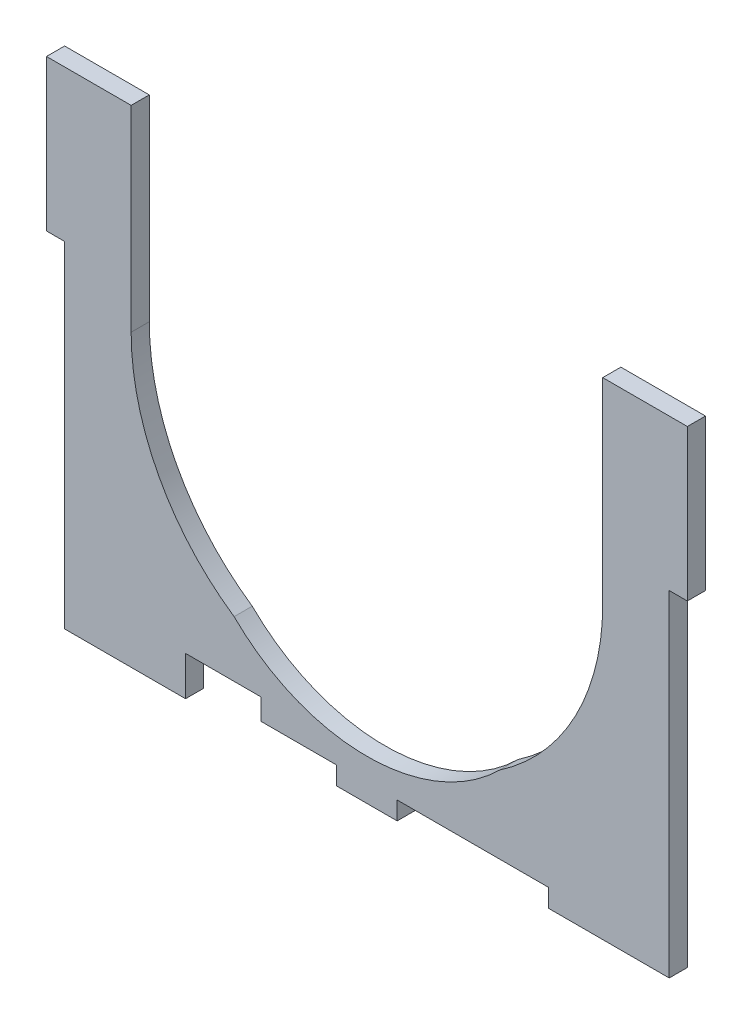
ISO-10303-21;
HEADER;
FILE_DESCRIPTION(('STEP AP214'),'2;1');
FILE_NAME('part.step','',(''),(''),'','','');
FILE_SCHEMA(('AUTOMOTIVE_DESIGN { 1 0 10303 214 1 1 1 1 }'));
ENDSEC;
DATA;
#1=APPLICATION_CONTEXT('core data for automotive mechanical design processes');
#2=APPLICATION_PROTOCOL_DEFINITION('international standard','automotive_design',2000,#1);
#3=PRODUCT_CONTEXT('',#1,'mechanical');
#4=PRODUCT('Part','Part','',(#3));
#5=PRODUCT_RELATED_PRODUCT_CATEGORY('part','',(#4));
#6=PRODUCT_DEFINITION_FORMATION('','',#4);
#7=PRODUCT_DEFINITION_CONTEXT('part definition',#1,'design');
#8=PRODUCT_DEFINITION('design','',#6,#7);
#9=PRODUCT_DEFINITION_SHAPE('','',#8);
#10=(LENGTH_UNIT() NAMED_UNIT(*) SI_UNIT(.MILLI.,.METRE.));
#11=(NAMED_UNIT(*) PLANE_ANGLE_UNIT() SI_UNIT($,.RADIAN.));
#12=(NAMED_UNIT(*) SI_UNIT($,.STERADIAN.) SOLID_ANGLE_UNIT());
#13=UNCERTAINTY_MEASURE_WITH_UNIT(LENGTH_MEASURE(1.E-05),#10,'distance_accuracy_value','');
#14=(GEOMETRIC_REPRESENTATION_CONTEXT(3) GLOBAL_UNCERTAINTY_ASSIGNED_CONTEXT((#13)) GLOBAL_UNIT_ASSIGNED_CONTEXT((#10,
#11,#12)) REPRESENTATION_CONTEXT('',''));
#15=CARTESIAN_POINT('',(0.,0.,0.));
#16=DIRECTION('',(0.,0.,1.));
#17=DIRECTION('',(1.,0.,0.));
#18=AXIS2_PLACEMENT_3D('',#15,#16,#17);
#19=CARTESIAN_POINT('',(0.,0.,6.));
#20=DIRECTION('',(0.,1.,0.));
#21=DIRECTION('',(-1.,0.,0.));
#22=AXIS2_PLACEMENT_3D('',#19,#20,#21);
#23=PLANE('',#22);
#24=DIRECTION('',(1.,0.,0.));
#25=VECTOR('',#24,1.);
#26=CARTESIAN_POINT('',(0.,0.,6.));
#27=LINE('',#26,#25);
#28=CARTESIAN_POINT('',(-135.,0.,6.));
#29=VERTEX_POINT('',#28);
#30=CARTESIAN_POINT('',(-110.,0.,6.));
#31=VERTEX_POINT('',#30);
#32=EDGE_CURVE('E220',#29,#31,#27,.T.);
#33=ORIENTED_EDGE('',*,*,#32,.F.);
#34=DIRECTION('',(0.,0.,1.));
#35=VECTOR('',#34,1.);
#36=CARTESIAN_POINT('',(-135.,0.,-4.));
#37=LINE('',#36,#35);
#38=CARTESIAN_POINT('',(-135.,0.,0.));
#39=VERTEX_POINT('',#38);
#40=EDGE_CURVE('E203',#39,#29,#37,.T.);
#41=ORIENTED_EDGE('',*,*,#40,.F.);
#42=DIRECTION('',(1.,0.,0.));
#43=VECTOR('',#42,1.);
#44=CARTESIAN_POINT('',(0.,0.,0.));
#45=LINE('',#44,#43);
#46=CARTESIAN_POINT('',(-110.,0.,0.));
#47=VERTEX_POINT('',#46);
#48=EDGE_CURVE('E270',#39,#47,#45,.T.);
#49=ORIENTED_EDGE('',*,*,#48,.T.);
#50=DIRECTION('',(0.,0.,1.));
#51=VECTOR('',#50,1.);
#52=CARTESIAN_POINT('',(-110.,0.,0.));
#53=LINE('',#52,#51);
#54=EDGE_CURVE('E226',#47,#31,#53,.T.);
#55=ORIENTED_EDGE('',*,*,#54,.T.);
#56=EDGE_LOOP('',(#33,#41,#49,#55));
#57=FACE_BOUND('',#56,.T.);
#58=ADVANCED_FACE('F43',(#57),#23,.F.);
#59=CARTESIAN_POINT('',(-90.,0.,0.));
#60=VERTEX_POINT('',#59);
#61=CARTESIAN_POINT('',(-40.,0.,0.));
#62=VERTEX_POINT('',#61);
#63=EDGE_CURVE('E64',#60,#62,#45,.T.);
#64=ORIENTED_EDGE('',*,*,#63,.T.);
#65=DIRECTION('',(0.,0.,1.));
#66=VECTOR('',#65,1.);
#67=CARTESIAN_POINT('',(-40.,0.,0.));
#68=LINE('',#67,#66);
#69=CARTESIAN_POINT('',(-40.,0.,6.));
#70=VERTEX_POINT('',#69);
#71=EDGE_CURVE('E59',#62,#70,#68,.T.);
#72=ORIENTED_EDGE('',*,*,#71,.T.);
#73=CARTESIAN_POINT('',(-90.,0.,6.));
#74=VERTEX_POINT('',#73);
#75=EDGE_CURVE('E230',#74,#70,#27,.T.);
#76=ORIENTED_EDGE('',*,*,#75,.F.);
#77=DIRECTION('',(0.,0.,1.));
#78=VECTOR('',#77,1.);
#79=CARTESIAN_POINT('',(-90.,0.,0.));
#80=LINE('',#79,#78);
#81=EDGE_CURVE('E304',#60,#74,#80,.T.);
#82=ORIENTED_EDGE('',*,*,#81,.F.);
#83=EDGE_LOOP('',(#64,#72,#76,#82));
#84=FACE_BOUND('',#83,.T.);
#85=ADVANCED_FACE('F556',(#84),#23,.F.);
#86=CARTESIAN_POINT('',(-200.,0.,6.));
#87=DIRECTION('',(1.,0.,0.));
#88=DIRECTION('',(0.,0.,-1.));
#89=AXIS2_PLACEMENT_3D('',#86,#87,#88);
#90=PLANE('',#89);
#91=DIRECTION('',(0.,0.,1.));
#92=VECTOR('',#91,1.);
#93=CARTESIAN_POINT('',(-200.,105.,0.));
#94=LINE('',#93,#92);
#95=CARTESIAN_POINT('',(-200.,105.,0.));
#96=VERTEX_POINT('',#95);
#97=CARTESIAN_POINT('',(-200.,105.,6.));
#98=VERTEX_POINT('',#97);
#99=EDGE_CURVE('E246',#96,#98,#94,.T.);
#100=ORIENTED_EDGE('',*,*,#99,.F.);
#101=DIRECTION('',(0.,-1.,0.));
#102=VECTOR('',#101,1.);
#103=CARTESIAN_POINT('',(-200.,0.,0.));
#104=LINE('',#103,#102);
#105=CARTESIAN_POINT('',(-200.,-5.99999999999998,0.));
#106=VERTEX_POINT('',#105);
#107=EDGE_CURVE('E267',#96,#106,#104,.T.);
#108=ORIENTED_EDGE('',*,*,#107,.T.);
#109=DIRECTION('',(0.,0.,1.));
#110=VECTOR('',#109,1.);
#111=CARTESIAN_POINT('',(-200.,-5.99999999999998,0.));
#112=LINE('',#111,#110);
#113=CARTESIAN_POINT('',(-200.,-5.99999999999998,6.));
#114=VERTEX_POINT('',#113);
#115=EDGE_CURVE('E347',#106,#114,#112,.T.);
#116=ORIENTED_EDGE('',*,*,#115,.T.);
#117=DIRECTION('',(0.,-1.,0.));
#118=VECTOR('',#117,1.);
#119=CARTESIAN_POINT('',(-200.,0.,6.));
#120=LINE('',#119,#118);
#121=EDGE_CURVE('E237',#98,#114,#120,.T.);
#122=ORIENTED_EDGE('',*,*,#121,.F.);
#123=EDGE_LOOP('',(#100,#108,#116,#122));
#124=FACE_BOUND('',#123,.T.);
#125=ADVANCED_FACE('F440',(#124),#90,.F.);
#126=CARTESIAN_POINT('',(0.,0.,6.));
#127=DIRECTION('',(-1.,0.,0.));
#128=DIRECTION('',(0.,-1.,0.));
#129=AXIS2_PLACEMENT_3D('',#126,#127,#128);
#130=PLANE('',#129);
#131=DIRECTION('',(0.,1.,0.));
#132=VECTOR('',#131,1.);
#133=CARTESIAN_POINT('',(0.,0.,0.));
#134=LINE('',#133,#132);
#135=CARTESIAN_POINT('',(0.,-5.99999999999998,0.));
#136=VERTEX_POINT('',#135);
#137=CARTESIAN_POINT('',(0.,105.,0.));
#138=VERTEX_POINT('',#137);
#139=EDGE_CURVE('E241',#136,#138,#134,.T.);
#140=ORIENTED_EDGE('',*,*,#139,.T.);
#141=DIRECTION('',(0.,0.,1.));
#142=VECTOR('',#141,1.);
#143=CARTESIAN_POINT('',(0.,105.,0.));
#144=LINE('',#143,#142);
#145=CARTESIAN_POINT('',(0.,105.,6.));
#146=VERTEX_POINT('',#145);
#147=EDGE_CURVE('E380',#138,#146,#144,.T.);
#148=ORIENTED_EDGE('',*,*,#147,.T.);
#149=DIRECTION('',(0.,1.,0.));
#150=VECTOR('',#149,1.);
#151=CARTESIAN_POINT('',(0.,0.,6.));
#152=LINE('',#151,#150);
#153=CARTESIAN_POINT('',(0.,-5.99999999999998,6.));
#154=VERTEX_POINT('',#153);
#155=EDGE_CURVE('E272',#154,#146,#152,.T.);
#156=ORIENTED_EDGE('',*,*,#155,.F.);
#157=DIRECTION('',(0.,0.,1.));
#158=VECTOR('',#157,1.);
#159=CARTESIAN_POINT('',(0.,-5.99999999999998,0.));
#160=LINE('',#159,#158);
#161=EDGE_CURVE('E453',#136,#154,#160,.T.);
#162=ORIENTED_EDGE('',*,*,#161,.F.);
#163=EDGE_LOOP('',(#140,#148,#156,#162));
#164=FACE_BOUND('',#163,.T.);
#165=ADVANCED_FACE('F45',(#164),#130,.F.);
#166=CARTESIAN_POINT('',(0.,155.,6.));
#167=DIRECTION('',(0.,-1.,0.));
#168=DIRECTION('',(0.,0.,-1.));
#169=AXIS2_PLACEMENT_3D('',#166,#167,#168);
#170=PLANE('',#169);
#171=DIRECTION('',(-1.,0.,0.));
#172=VECTOR('',#171,1.);
#173=CARTESIAN_POINT('',(0.,155.,0.));
#174=LINE('',#173,#172);
#175=CARTESIAN_POINT('',(6.00000000000003,155.,0.));
#176=VERTEX_POINT('',#175);
#177=CARTESIAN_POINT('',(-21.9999999999999,155.,0.));
#178=VERTEX_POINT('',#177);
#179=EDGE_CURVE('E245',#176,#178,#174,.T.);
#180=ORIENTED_EDGE('',*,*,#179,.T.);
#181=DIRECTION('',(0.,0.,-1.));
#182=VECTOR('',#181,1.);
#183=CARTESIAN_POINT('',(-21.9999999999999,155.,6.));
#184=LINE('',#183,#182);
#185=CARTESIAN_POINT('',(-21.9999999999999,155.,6.));
#186=VERTEX_POINT('',#185);
#187=EDGE_CURVE('E289',#186,#178,#184,.T.);
#188=ORIENTED_EDGE('',*,*,#187,.F.);
#189=DIRECTION('',(-1.,0.,0.));
#190=VECTOR('',#189,1.);
#191=CARTESIAN_POINT('',(0.,155.,6.));
#192=LINE('',#191,#190);
#193=CARTESIAN_POINT('',(6.00000000000003,155.,6.));
#194=VERTEX_POINT('',#193);
#195=EDGE_CURVE('E415',#194,#186,#192,.T.);
#196=ORIENTED_EDGE('',*,*,#195,.F.);
#197=DIRECTION('',(0.,0.,1.));
#198=VECTOR('',#197,1.);
#199=CARTESIAN_POINT('',(6.00000000000003,155.,0.));
#200=LINE('',#199,#198);
#201=EDGE_CURVE('E369',#176,#194,#200,.T.);
#202=ORIENTED_EDGE('',*,*,#201,.F.);
#203=EDGE_LOOP('',(#180,#188,#196,#202));
#204=FACE_BOUND('',#203,.T.);
#205=ADVANCED_FACE('F512',(#204),#170,.F.);
#206=CARTESIAN_POINT('',(-22.,90.,6.));
#207=DIRECTION('',(1.,0.,0.));
#208=DIRECTION('',(0.,1.,0.));
#209=AXIS2_PLACEMENT_3D('',#206,#207,#208);
#210=PLANE('',#209);
#211=DIRECTION('',(0.,-1.,0.));
#212=VECTOR('',#211,1.);
#213=CARTESIAN_POINT('',(-22.,90.,0.));
#214=LINE('',#213,#212);
#215=CARTESIAN_POINT('',(-22.,90.,0.));
#216=VERTEX_POINT('',#215);
#217=EDGE_CURVE('E249',#178,#216,#214,.T.);
#218=ORIENTED_EDGE('',*,*,#217,.T.);
#219=DIRECTION('',(0.,0.,-1.));
#220=VECTOR('',#219,1.);
#221=CARTESIAN_POINT('',(-22.,90.,6.));
#222=LINE('',#221,#220);
#223=CARTESIAN_POINT('',(-22.,90.,6.));
#224=VERTEX_POINT('',#223);
#225=EDGE_CURVE('E285',#224,#216,#222,.T.);
#226=ORIENTED_EDGE('',*,*,#225,.F.);
#227=DIRECTION('',(0.,-1.,0.));
#228=VECTOR('',#227,1.);
#229=CARTESIAN_POINT('',(-22.,90.,6.));
#230=LINE('',#229,#228);
#231=EDGE_CURVE('E418',#186,#224,#230,.T.);
#232=ORIENTED_EDGE('',*,*,#231,.F.);
#233=ORIENTED_EDGE('',*,*,#187,.T.);
#234=EDGE_LOOP('',(#218,#226,#232,#233));
#235=FACE_BOUND('',#234,.T.);
#236=ADVANCED_FACE('F514',(#235),#210,.F.);
#237=CARTESIAN_POINT('',(-100.,90.,6.));
#238=DIRECTION('',(0.,0.,-1.));
#239=DIRECTION('',(-1.,0.,0.));
#240=AXIS2_PLACEMENT_3D('',#237,#238,#239);
#241=CYLINDRICAL_SURFACE('',#240,78.);
#242=CARTESIAN_POINT('',(-100.,90.,0.));
#243=DIRECTION('',(0.,0.,-1.));
#244=DIRECTION('',(1.,0.,0.));
#245=AXIS2_PLACEMENT_3D('',#242,#243,#244);
#246=CIRCLE('',#245,78.);
#247=CARTESIAN_POINT('',(-56.0568198017315,25.5562499999999,0.));
#248=VERTEX_POINT('',#247);
#249=EDGE_CURVE('E252',#216,#248,#246,.T.);
#250=ORIENTED_EDGE('',*,*,#249,.T.);
#251=DIRECTION('',(0.,0.,-1.));
#252=VECTOR('',#251,1.);
#253=CARTESIAN_POINT('',(-56.0568198017315,25.5562499999999,6.));
#254=LINE('',#253,#252);
#255=CARTESIAN_POINT('',(-56.0568198017315,25.5562499999999,6.));
#256=VERTEX_POINT('',#255);
#257=EDGE_CURVE('E281',#256,#248,#254,.T.);
#258=ORIENTED_EDGE('',*,*,#257,.F.);
#259=CARTESIAN_POINT('',(-100.,90.,6.));
#260=DIRECTION('',(0.,0.,-1.));
#261=DIRECTION('',(1.,0.,0.));
#262=AXIS2_PLACEMENT_3D('',#259,#260,#261);
#263=CIRCLE('',#262,78.);
#264=EDGE_CURVE('E421',#224,#256,#263,.T.);
#265=ORIENTED_EDGE('',*,*,#264,.F.);
#266=ORIENTED_EDGE('',*,*,#225,.T.);
#267=EDGE_LOOP('',(#250,#258,#265,#266));
#268=FACE_BOUND('',#267,.T.);
#269=ADVANCED_FACE('F519',(#268),#241,.F.);
#270=CARTESIAN_POINT('',(-100.,70.,6.));
#271=DIRECTION('',(0.,0.,-1.));
#272=DIRECTION('',(-1.,0.,0.));
#273=AXIS2_PLACEMENT_3D('',#270,#271,#272);
#274=CYLINDRICAL_SURFACE('',#273,62.5);
#275=CARTESIAN_POINT('',(-100.,70.,0.));
#276=DIRECTION('',(0.,0.,-1.));
#277=DIRECTION('',(1.,0.,0.));
#278=AXIS2_PLACEMENT_3D('',#275,#276,#277);
#279=CIRCLE('',#278,62.5);
#280=CARTESIAN_POINT('',(-143.943180198269,25.5562500000001,0.));
#281=VERTEX_POINT('',#280);
#282=EDGE_CURVE('E255',#248,#281,#279,.T.);
#283=ORIENTED_EDGE('',*,*,#282,.T.);
#284=DIRECTION('',(0.,0.,-1.));
#285=VECTOR('',#284,1.);
#286=CARTESIAN_POINT('',(-143.943180198269,25.5562500000001,6.));
#287=LINE('',#286,#285);
#288=CARTESIAN_POINT('',(-143.943180198269,25.5562500000001,6.));
#289=VERTEX_POINT('',#288);
#290=EDGE_CURVE('E277',#289,#281,#287,.T.);
#291=ORIENTED_EDGE('',*,*,#290,.F.);
#292=CARTESIAN_POINT('',(-100.,70.,6.));
#293=DIRECTION('',(0.,0.,-1.));
#294=DIRECTION('',(1.,0.,0.));
#295=AXIS2_PLACEMENT_3D('',#292,#293,#294);
#296=CIRCLE('',#295,62.5);
#297=EDGE_CURVE('E424',#256,#289,#296,.T.);
#298=ORIENTED_EDGE('',*,*,#297,.F.);
#299=ORIENTED_EDGE('',*,*,#257,.T.);
#300=EDGE_LOOP('',(#283,#291,#298,#299));
#301=FACE_BOUND('',#300,.T.);
#302=ADVANCED_FACE('F525',(#301),#274,.F.);
#303=CARTESIAN_POINT('',(-100.,90.,6.));
#304=DIRECTION('',(0.,0.,-1.));
#305=DIRECTION('',(-1.,0.,0.));
#306=AXIS2_PLACEMENT_3D('',#303,#304,#305);
#307=CYLINDRICAL_SURFACE('',#306,78.);
#308=CARTESIAN_POINT('',(-100.,90.,0.));
#309=DIRECTION('',(0.,0.,-1.));
#310=DIRECTION('',(1.,0.,0.));
#311=AXIS2_PLACEMENT_3D('',#308,#309,#310);
#312=CIRCLE('',#311,78.);
#313=CARTESIAN_POINT('',(-178.,90.,0.));
#314=VERTEX_POINT('',#313);
#315=EDGE_CURVE('E258',#281,#314,#312,.T.);
#316=ORIENTED_EDGE('',*,*,#315,.T.);
#317=DIRECTION('',(0.,0.,-1.));
#318=VECTOR('',#317,1.);
#319=CARTESIAN_POINT('',(-178.,90.,6.));
#320=LINE('',#319,#318);
#321=CARTESIAN_POINT('',(-178.,90.,6.));
#322=VERTEX_POINT('',#321);
#323=EDGE_CURVE('E235',#322,#314,#320,.T.);
#324=ORIENTED_EDGE('',*,*,#323,.F.);
#325=CARTESIAN_POINT('',(-100.,90.,6.));
#326=DIRECTION('',(0.,0.,-1.));
#327=DIRECTION('',(1.,0.,0.));
#328=AXIS2_PLACEMENT_3D('',#325,#326,#327);
#329=CIRCLE('',#328,78.);
#330=EDGE_CURVE('E427',#289,#322,#329,.T.);
#331=ORIENTED_EDGE('',*,*,#330,.F.);
#332=ORIENTED_EDGE('',*,*,#290,.T.);
#333=EDGE_LOOP('',(#316,#324,#331,#332));
#334=FACE_BOUND('',#333,.T.);
#335=ADVANCED_FACE('F529',(#334),#307,.F.);
#336=CARTESIAN_POINT('',(-178.,90.,6.));
#337=DIRECTION('',(-1.,0.,0.));
#338=DIRECTION('',(0.,-1.,0.));
#339=AXIS2_PLACEMENT_3D('',#336,#337,#338);
#340=PLANE('',#339);
#341=DIRECTION('',(0.,1.,0.));
#342=VECTOR('',#341,1.);
#343=CARTESIAN_POINT('',(-178.,90.,0.));
#344=LINE('',#343,#342);
#345=CARTESIAN_POINT('',(-178.,155.,0.));
#346=VERTEX_POINT('',#345);
#347=EDGE_CURVE('E261',#314,#346,#344,.T.);
#348=ORIENTED_EDGE('',*,*,#347,.T.);
#349=DIRECTION('',(0.,0.,-1.));
#350=VECTOR('',#349,1.);
#351=CARTESIAN_POINT('',(-178.,155.,6.));
#352=LINE('',#351,#350);
#353=CARTESIAN_POINT('',(-178.,155.,6.));
#354=VERTEX_POINT('',#353);
#355=EDGE_CURVE('E229',#354,#346,#352,.T.);
#356=ORIENTED_EDGE('',*,*,#355,.F.);
#357=DIRECTION('',(0.,1.,0.));
#358=VECTOR('',#357,1.);
#359=CARTESIAN_POINT('',(-178.,90.,6.));
#360=LINE('',#359,#358);
#361=EDGE_CURVE('E430',#322,#354,#360,.T.);
#362=ORIENTED_EDGE('',*,*,#361,.F.);
#363=ORIENTED_EDGE('',*,*,#323,.T.);
#364=EDGE_LOOP('',(#348,#356,#362,#363));
#365=FACE_BOUND('',#364,.T.);
#366=ADVANCED_FACE('F534',(#365),#340,.F.);
#367=CARTESIAN_POINT('',(-178.,155.,6.));
#368=DIRECTION('',(0.,-1.,0.));
#369=DIRECTION('',(0.,0.,-1.));
#370=AXIS2_PLACEMENT_3D('',#367,#368,#369);
#371=PLANE('',#370);
#372=DIRECTION('',(-1.,0.,0.));
#373=VECTOR('',#372,1.);
#374=CARTESIAN_POINT('',(-178.,155.,0.));
#375=LINE('',#374,#373);
#376=CARTESIAN_POINT('',(-206.,155.,0.));
#377=VERTEX_POINT('',#376);
#378=EDGE_CURVE('E264',#346,#377,#375,.T.);
#379=ORIENTED_EDGE('',*,*,#378,.T.);
#380=DIRECTION('',(0.,0.,1.));
#381=VECTOR('',#380,1.);
#382=CARTESIAN_POINT('',(-206.,155.,0.));
#383=LINE('',#382,#381);
#384=CARTESIAN_POINT('',(-206.,155.,6.));
#385=VERTEX_POINT('',#384);
#386=EDGE_CURVE('E396',#377,#385,#383,.T.);
#387=ORIENTED_EDGE('',*,*,#386,.T.);
#388=DIRECTION('',(-1.,0.,0.));
#389=VECTOR('',#388,1.);
#390=CARTESIAN_POINT('',(-178.,155.,6.));
#391=LINE('',#390,#389);
#392=EDGE_CURVE('E432',#354,#385,#391,.T.);
#393=ORIENTED_EDGE('',*,*,#392,.F.);
#394=ORIENTED_EDGE('',*,*,#355,.T.);
#395=EDGE_LOOP('',(#379,#387,#393,#394));
#396=FACE_BOUND('',#395,.T.);
#397=ADVANCED_FACE('F537',(#396),#371,.F.);
#398=CARTESIAN_POINT('',(-100.,90.,6.));
#399=DIRECTION('',(0.,0.,1.));
#400=DIRECTION('',(1.,0.,0.));
#401=AXIS2_PLACEMENT_3D('',#398,#399,#400);
#402=PLANE('',#401);
#403=DIRECTION('',(0.,1.,0.));
#404=VECTOR('',#403,1.);
#405=CARTESIAN_POINT('',(-160.,0.,6.));
#406=LINE('',#405,#404);
#407=CARTESIAN_POINT('',(-160.,-5.99999999999998,6.));
#408=VERTEX_POINT('',#407);
#409=CARTESIAN_POINT('',(-160.,7.,6.));
#410=VERTEX_POINT('',#409);
#411=EDGE_CURVE('E344',#408,#410,#406,.T.);
#412=ORIENTED_EDGE('',*,*,#411,.T.);
#413=DIRECTION('',(-1.,0.,0.));
#414=VECTOR('',#413,1.);
#415=CARTESIAN_POINT('',(-160.,7.,6.));
#416=LINE('',#415,#414);
#417=CARTESIAN_POINT('',(-135.,7.,6.));
#418=VERTEX_POINT('',#417);
#419=EDGE_CURVE('E215',#418,#410,#416,.T.);
#420=ORIENTED_EDGE('',*,*,#419,.F.);
#421=DIRECTION('',(0.,1.,0.));
#422=VECTOR('',#421,1.);
#423=CARTESIAN_POINT('',(-135.,0.,6.));
#424=LINE('',#423,#422);
#425=EDGE_CURVE('E207',#29,#418,#424,.T.);
#426=ORIENTED_EDGE('',*,*,#425,.F.);
#427=ORIENTED_EDGE('',*,*,#32,.T.);
#428=DIRECTION('',(0.,-1.,0.));
#429=VECTOR('',#428,1.);
#430=CARTESIAN_POINT('',(-110.,0.,6.));
#431=LINE('',#430,#429);
#432=CARTESIAN_POINT('',(-110.,-5.99999999999998,6.));
#433=VERTEX_POINT('',#432);
#434=EDGE_CURVE('E302',#31,#433,#431,.T.);
#435=ORIENTED_EDGE('',*,*,#434,.T.);
#436=DIRECTION('',(1.,0.,0.));
#437=VECTOR('',#436,1.);
#438=CARTESIAN_POINT('',(-110.,-5.99999999999998,6.));
#439=LINE('',#438,#437);
#440=CARTESIAN_POINT('',(-90.,-5.99999999999997,6.));
#441=VERTEX_POINT('',#440);
#442=EDGE_CURVE('E321',#433,#441,#439,.T.);
#443=ORIENTED_EDGE('',*,*,#442,.T.);
#444=DIRECTION('',(0.,1.,0.));
#445=VECTOR('',#444,1.);
#446=CARTESIAN_POINT('',(-90.,0.,6.));
#447=LINE('',#446,#445);
#448=EDGE_CURVE('E317',#441,#74,#447,.T.);
#449=ORIENTED_EDGE('',*,*,#448,.T.);
#450=ORIENTED_EDGE('',*,*,#75,.T.);
#451=DIRECTION('',(0.,-1.,0.));
#452=VECTOR('',#451,1.);
#453=CARTESIAN_POINT('',(-40.,0.,6.));
#454=LINE('',#453,#452);
#455=CARTESIAN_POINT('',(-40.,-5.99999999999998,6.));
#456=VERTEX_POINT('',#455);
#457=EDGE_CURVE('E305',#70,#456,#454,.T.);
#458=ORIENTED_EDGE('',*,*,#457,.T.);
#459=DIRECTION('',(1.,0.,0.));
#460=VECTOR('',#459,1.);
#461=CARTESIAN_POINT('',(0.,-5.99999999999998,6.));
#462=LINE('',#461,#460);
#463=EDGE_CURVE('E313',#456,#154,#462,.T.);
#464=ORIENTED_EDGE('',*,*,#463,.T.);
#465=ORIENTED_EDGE('',*,*,#155,.T.);
#466=DIRECTION('',(1.,0.,0.));
#467=VECTOR('',#466,1.);
#468=CARTESIAN_POINT('',(6.00000000000003,105.,6.));
#469=LINE('',#468,#467);
#470=CARTESIAN_POINT('',(6.00000000000003,105.,6.));
#471=VERTEX_POINT('',#470);
#472=EDGE_CURVE('E365',#146,#471,#469,.T.);
#473=ORIENTED_EDGE('',*,*,#472,.T.);
#474=DIRECTION('',(0.,1.,0.));
#475=VECTOR('',#474,1.);
#476=CARTESIAN_POINT('',(6.00000000000003,155.,6.));
#477=LINE('',#476,#475);
#478=EDGE_CURVE('E356',#471,#194,#477,.T.);
#479=ORIENTED_EDGE('',*,*,#478,.T.);
#480=ORIENTED_EDGE('',*,*,#195,.T.);
#481=ORIENTED_EDGE('',*,*,#231,.T.);
#482=ORIENTED_EDGE('',*,*,#264,.T.);
#483=ORIENTED_EDGE('',*,*,#297,.T.);
#484=ORIENTED_EDGE('',*,*,#330,.T.);
#485=ORIENTED_EDGE('',*,*,#361,.T.);
#486=ORIENTED_EDGE('',*,*,#392,.T.);
#487=DIRECTION('',(0.,-1.,0.));
#488=VECTOR('',#487,1.);
#489=CARTESIAN_POINT('',(-206.,155.,6.));
#490=LINE('',#489,#488);
#491=CARTESIAN_POINT('',(-206.,105.,6.));
#492=VERTEX_POINT('',#491);
#493=EDGE_CURVE('E379',#385,#492,#490,.T.);
#494=ORIENTED_EDGE('',*,*,#493,.T.);
#495=DIRECTION('',(1.,0.,0.));
#496=VECTOR('',#495,1.);
#497=CARTESIAN_POINT('',(-200.,105.,6.));
#498=LINE('',#497,#496);
#499=EDGE_CURVE('E392',#492,#98,#498,.T.);
#500=ORIENTED_EDGE('',*,*,#499,.T.);
#501=ORIENTED_EDGE('',*,*,#121,.T.);
#502=DIRECTION('',(1.,0.,0.));
#503=VECTOR('',#502,1.);
#504=CARTESIAN_POINT('',(-200.,-5.99999999999998,6.));
#505=LINE('',#504,#503);
#506=EDGE_CURVE('E327',#114,#408,#505,.T.);
#507=ORIENTED_EDGE('',*,*,#506,.T.);
#508=EDGE_LOOP('',(#412,#420,#426,#427,#435,#443,#449,#450,#458,#464,#465,#473,#479,#480,#481,
#482,#483,#484,#485,#486,#494,#500,#501,#507));
#509=FACE_BOUND('',#508,.T.);
#510=ADVANCED_FACE('F218',(#509),#402,.T.);
#511=CARTESIAN_POINT('',(-100.,90.,0.));
#512=DIRECTION('',(0.,0.,1.));
#513=DIRECTION('',(1.,0.,0.));
#514=AXIS2_PLACEMENT_3D('',#511,#512,#513);
#515=PLANE('',#514);
#516=DIRECTION('',(-1.,0.,0.));
#517=VECTOR('',#516,1.);
#518=CARTESIAN_POINT('',(-100.,7.00000000000001,0.));
#519=LINE('',#518,#517);
#520=CARTESIAN_POINT('',(-135.,7.,0.));
#521=VERTEX_POINT('',#520);
#522=CARTESIAN_POINT('',(-160.,7.,0.));
#523=VERTEX_POINT('',#522);
#524=EDGE_CURVE('E11',#521,#523,#519,.T.);
#525=ORIENTED_EDGE('',*,*,#524,.T.);
#526=DIRECTION('',(0.,1.,0.));
#527=VECTOR('',#526,1.);
#528=CARTESIAN_POINT('',(-160.,0.,0.));
#529=LINE('',#528,#527);
#530=CARTESIAN_POINT('',(-160.,-5.99999999999998,0.));
#531=VERTEX_POINT('',#530);
#532=EDGE_CURVE('E343',#531,#523,#529,.T.);
#533=ORIENTED_EDGE('',*,*,#532,.F.);
#534=DIRECTION('',(1.,0.,0.));
#535=VECTOR('',#534,1.);
#536=CARTESIAN_POINT('',(-200.,-5.99999999999998,0.));
#537=LINE('',#536,#535);
#538=EDGE_CURVE('E339',#106,#531,#537,.T.);
#539=ORIENTED_EDGE('',*,*,#538,.F.);
#540=ORIENTED_EDGE('',*,*,#107,.F.);
#541=DIRECTION('',(1.,0.,0.));
#542=VECTOR('',#541,1.);
#543=CARTESIAN_POINT('',(-200.,105.,0.));
#544=LINE('',#543,#542);
#545=CARTESIAN_POINT('',(-206.,105.,0.));
#546=VERTEX_POINT('',#545);
#547=EDGE_CURVE('E391',#546,#96,#544,.T.);
#548=ORIENTED_EDGE('',*,*,#547,.F.);
#549=DIRECTION('',(0.,-1.,0.));
#550=VECTOR('',#549,1.);
#551=CARTESIAN_POINT('',(-206.,155.,0.));
#552=LINE('',#551,#550);
#553=EDGE_CURVE('E387',#377,#546,#552,.T.);
#554=ORIENTED_EDGE('',*,*,#553,.F.);
#555=ORIENTED_EDGE('',*,*,#378,.F.);
#556=ORIENTED_EDGE('',*,*,#347,.F.);
#557=ORIENTED_EDGE('',*,*,#315,.F.);
#558=ORIENTED_EDGE('',*,*,#282,.F.);
#559=ORIENTED_EDGE('',*,*,#249,.F.);
#560=ORIENTED_EDGE('',*,*,#217,.F.);
#561=ORIENTED_EDGE('',*,*,#179,.F.);
#562=DIRECTION('',(0.,1.,0.));
#563=VECTOR('',#562,1.);
#564=CARTESIAN_POINT('',(6.00000000000003,155.,0.));
#565=LINE('',#564,#563);
#566=CARTESIAN_POINT('',(6.00000000000003,105.,0.));
#567=VERTEX_POINT('',#566);
#568=EDGE_CURVE('E360',#567,#176,#565,.T.);
#569=ORIENTED_EDGE('',*,*,#568,.F.);
#570=DIRECTION('',(1.,0.,0.));
#571=VECTOR('',#570,1.);
#572=CARTESIAN_POINT('',(6.00000000000003,105.,0.));
#573=LINE('',#572,#571);
#574=EDGE_CURVE('E364',#138,#567,#573,.T.);
#575=ORIENTED_EDGE('',*,*,#574,.F.);
#576=ORIENTED_EDGE('',*,*,#139,.F.);
#577=DIRECTION('',(1.,0.,0.));
#578=VECTOR('',#577,1.);
#579=CARTESIAN_POINT('',(0.,-5.99999999999998,0.));
#580=LINE('',#579,#578);
#581=CARTESIAN_POINT('',(-40.,-5.99999999999998,0.));
#582=VERTEX_POINT('',#581);
#583=EDGE_CURVE('E463',#582,#136,#580,.T.);
#584=ORIENTED_EDGE('',*,*,#583,.F.);
#585=DIRECTION('',(0.,-1.,0.));
#586=VECTOR('',#585,1.);
#587=CARTESIAN_POINT('',(-40.,0.,0.));
#588=LINE('',#587,#586);
#589=EDGE_CURVE('E472',#62,#582,#588,.T.);
#590=ORIENTED_EDGE('',*,*,#589,.F.);
#591=ORIENTED_EDGE('',*,*,#63,.F.);
#592=DIRECTION('',(0.,1.,0.));
#593=VECTOR('',#592,1.);
#594=CARTESIAN_POINT('',(-90.,0.,0.));
#595=LINE('',#594,#593);
#596=CARTESIAN_POINT('',(-90.,-5.99999999999997,0.));
#597=VERTEX_POINT('',#596);
#598=EDGE_CURVE('E328',#597,#60,#595,.T.);
#599=ORIENTED_EDGE('',*,*,#598,.F.);
#600=DIRECTION('',(1.,0.,0.));
#601=VECTOR('',#600,1.);
#602=CARTESIAN_POINT('',(-110.,-5.99999999999998,0.));
#603=LINE('',#602,#601);
#604=CARTESIAN_POINT('',(-110.,-5.99999999999998,0.));
#605=VERTEX_POINT('',#604);
#606=EDGE_CURVE('E332',#605,#597,#603,.T.);
#607=ORIENTED_EDGE('',*,*,#606,.F.);
#608=DIRECTION('',(0.,-1.,0.));
#609=VECTOR('',#608,1.);
#610=CARTESIAN_POINT('',(-110.,0.,0.));
#611=LINE('',#610,#609);
#612=EDGE_CURVE('E299',#47,#605,#611,.T.);
#613=ORIENTED_EDGE('',*,*,#612,.F.);
#614=ORIENTED_EDGE('',*,*,#48,.F.);
#615=DIRECTION('',(0.,1.,0.));
#616=VECTOR('',#615,1.);
#617=CARTESIAN_POINT('',(-135.,90.,0.));
#618=LINE('',#617,#616);
#619=EDGE_CURVE('E52',#39,#521,#618,.T.);
#620=ORIENTED_EDGE('',*,*,#619,.T.);
#621=EDGE_LOOP('',(#525,#533,#539,#540,#548,#554,#555,#556,#557,#558,#559,#560,#561,#569,#575,
#576,#584,#590,#591,#599,#607,#613,#614,#620));
#622=FACE_BOUND('',#621,.T.);
#623=ADVANCED_FACE('F294',(#622),#515,.F.);
#624=CARTESIAN_POINT('',(-200.,105.,0.));
#625=DIRECTION('',(0.,-1.,0.));
#626=DIRECTION('',(0.,0.,-1.));
#627=AXIS2_PLACEMENT_3D('',#624,#625,#626);
#628=PLANE('',#627);
#629=ORIENTED_EDGE('',*,*,#499,.F.);
#630=DIRECTION('',(0.,0.,1.));
#631=VECTOR('',#630,1.);
#632=CARTESIAN_POINT('',(-206.,105.,0.));
#633=LINE('',#632,#631);
#634=EDGE_CURVE('E406',#546,#492,#633,.T.);
#635=ORIENTED_EDGE('',*,*,#634,.F.);
#636=ORIENTED_EDGE('',*,*,#547,.T.);
#637=ORIENTED_EDGE('',*,*,#99,.T.);
#638=EDGE_LOOP('',(#629,#635,#636,#637));
#639=FACE_BOUND('',#638,.T.);
#640=ADVANCED_FACE('F544',(#639),#628,.T.);
#641=CARTESIAN_POINT('',(-206.,155.,0.));
#642=DIRECTION('',(-1.,0.,0.));
#643=DIRECTION('',(0.,0.,1.));
#644=AXIS2_PLACEMENT_3D('',#641,#642,#643);
#645=PLANE('',#644);
#646=ORIENTED_EDGE('',*,*,#493,.F.);
#647=ORIENTED_EDGE('',*,*,#386,.F.);
#648=ORIENTED_EDGE('',*,*,#553,.T.);
#649=ORIENTED_EDGE('',*,*,#634,.T.);
#650=EDGE_LOOP('',(#646,#647,#648,#649));
#651=FACE_BOUND('',#650,.T.);
#652=ADVANCED_FACE('F542',(#651),#645,.T.);
#653=CARTESIAN_POINT('',(6.00000000000003,155.,0.));
#654=DIRECTION('',(1.,0.,0.));
#655=DIRECTION('',(0.,0.,-1.));
#656=AXIS2_PLACEMENT_3D('',#653,#654,#655);
#657=PLANE('',#656);
#658=ORIENTED_EDGE('',*,*,#478,.F.);
#659=DIRECTION('',(0.,0.,1.));
#660=VECTOR('',#659,1.);
#661=CARTESIAN_POINT('',(6.00000000000003,105.,0.));
#662=LINE('',#661,#660);
#663=EDGE_CURVE('E376',#567,#471,#662,.T.);
#664=ORIENTED_EDGE('',*,*,#663,.F.);
#665=ORIENTED_EDGE('',*,*,#568,.T.);
#666=ORIENTED_EDGE('',*,*,#201,.T.);
#667=EDGE_LOOP('',(#658,#664,#665,#666));
#668=FACE_BOUND('',#667,.T.);
#669=ADVANCED_FACE('F507',(#668),#657,.T.);
#670=CARTESIAN_POINT('',(6.00000000000003,105.,0.));
#671=DIRECTION('',(0.,-1.,0.));
#672=DIRECTION('',(0.,0.,-1.));
#673=AXIS2_PLACEMENT_3D('',#670,#671,#672);
#674=PLANE('',#673);
#675=ORIENTED_EDGE('',*,*,#472,.F.);
#676=ORIENTED_EDGE('',*,*,#147,.F.);
#677=ORIENTED_EDGE('',*,*,#574,.T.);
#678=ORIENTED_EDGE('',*,*,#663,.T.);
#679=EDGE_LOOP('',(#675,#676,#677,#678));
#680=FACE_BOUND('',#679,.T.);
#681=ADVANCED_FACE('F501',(#680),#674,.T.);
#682=CARTESIAN_POINT('',(-160.,0.,0.));
#683=DIRECTION('',(1.,0.,0.));
#684=DIRECTION('',(0.,0.,-1.));
#685=AXIS2_PLACEMENT_3D('',#682,#683,#684);
#686=PLANE('',#685);
#687=ORIENTED_EDGE('',*,*,#411,.F.);
#688=DIRECTION('',(0.,0.,1.));
#689=VECTOR('',#688,1.);
#690=CARTESIAN_POINT('',(-160.,-5.99999999999998,0.));
#691=LINE('',#690,#689);
#692=EDGE_CURVE('E353',#531,#408,#691,.T.);
#693=ORIENTED_EDGE('',*,*,#692,.F.);
#694=ORIENTED_EDGE('',*,*,#532,.T.);
#695=DIRECTION('',(0.,0.,1.));
#696=VECTOR('',#695,1.);
#697=CARTESIAN_POINT('',(-160.,7.,-4.));
#698=LINE('',#697,#696);
#699=EDGE_CURVE('E450',#523,#410,#698,.T.);
#700=ORIENTED_EDGE('',*,*,#699,.T.);
#701=EDGE_LOOP('',(#687,#693,#694,#700));
#702=FACE_BOUND('',#701,.T.);
#703=ADVANCED_FACE('F448',(#702),#686,.T.);
#704=CARTESIAN_POINT('',(-200.,-5.99999999999998,0.));
#705=DIRECTION('',(0.,-1.,0.));
#706=DIRECTION('',(0.,0.,-1.));
#707=AXIS2_PLACEMENT_3D('',#704,#705,#706);
#708=PLANE('',#707);
#709=ORIENTED_EDGE('',*,*,#506,.F.);
#710=ORIENTED_EDGE('',*,*,#115,.F.);
#711=ORIENTED_EDGE('',*,*,#538,.T.);
#712=ORIENTED_EDGE('',*,*,#692,.T.);
#713=EDGE_LOOP('',(#709,#710,#711,#712));
#714=FACE_BOUND('',#713,.T.);
#715=ADVANCED_FACE('F444',(#714),#708,.T.);
#716=CARTESIAN_POINT('',(-110.,0.,0.));
#717=DIRECTION('',(-1.,0.,0.));
#718=DIRECTION('',(0.,0.,1.));
#719=AXIS2_PLACEMENT_3D('',#716,#717,#718);
#720=PLANE('',#719);
#721=ORIENTED_EDGE('',*,*,#434,.F.);
#722=ORIENTED_EDGE('',*,*,#54,.F.);
#723=ORIENTED_EDGE('',*,*,#612,.T.);
#724=DIRECTION('',(0.,0.,1.));
#725=VECTOR('',#724,1.);
#726=CARTESIAN_POINT('',(-110.,-5.99999999999998,0.));
#727=LINE('',#726,#725);
#728=EDGE_CURVE('E333',#605,#433,#727,.T.);
#729=ORIENTED_EDGE('',*,*,#728,.T.);
#730=EDGE_LOOP('',(#721,#722,#723,#729));
#731=FACE_BOUND('',#730,.T.);
#732=ADVANCED_FACE('F301',(#731),#720,.T.);
#733=CARTESIAN_POINT('',(-90.,0.,0.));
#734=DIRECTION('',(1.,0.,0.));
#735=DIRECTION('',(0.,0.,-1.));
#736=AXIS2_PLACEMENT_3D('',#733,#734,#735);
#737=PLANE('',#736);
#738=ORIENTED_EDGE('',*,*,#448,.F.);
#739=DIRECTION('',(0.,0.,1.));
#740=VECTOR('',#739,1.);
#741=CARTESIAN_POINT('',(-90.,-5.99999999999997,0.));
#742=LINE('',#741,#740);
#743=EDGE_CURVE('E310',#597,#441,#742,.T.);
#744=ORIENTED_EDGE('',*,*,#743,.F.);
#745=ORIENTED_EDGE('',*,*,#598,.T.);
#746=ORIENTED_EDGE('',*,*,#81,.T.);
#747=EDGE_LOOP('',(#738,#744,#745,#746));
#748=FACE_BOUND('',#747,.T.);
#749=ADVANCED_FACE('F488',(#748),#737,.T.);
#750=CARTESIAN_POINT('',(-110.,-5.99999999999998,0.));
#751=DIRECTION('',(0.,-1.,0.));
#752=DIRECTION('',(1.,0.,0.));
#753=AXIS2_PLACEMENT_3D('',#750,#751,#752);
#754=PLANE('',#753);
#755=ORIENTED_EDGE('',*,*,#442,.F.);
#756=ORIENTED_EDGE('',*,*,#728,.F.);
#757=ORIENTED_EDGE('',*,*,#606,.T.);
#758=ORIENTED_EDGE('',*,*,#743,.T.);
#759=EDGE_LOOP('',(#755,#756,#757,#758));
#760=FACE_BOUND('',#759,.T.);
#761=ADVANCED_FACE('F485',(#760),#754,.T.);
#762=CARTESIAN_POINT('',(0.,-5.99999999999998,0.));
#763=DIRECTION('',(0.,-1.,0.));
#764=DIRECTION('',(1.,0.,0.));
#765=AXIS2_PLACEMENT_3D('',#762,#763,#764);
#766=PLANE('',#765);
#767=ORIENTED_EDGE('',*,*,#463,.F.);
#768=DIRECTION('',(0.,0.,1.));
#769=VECTOR('',#768,1.);
#770=CARTESIAN_POINT('',(-40.,-5.99999999999998,0.));
#771=LINE('',#770,#769);
#772=EDGE_CURVE('E464',#582,#456,#771,.T.);
#773=ORIENTED_EDGE('',*,*,#772,.F.);
#774=ORIENTED_EDGE('',*,*,#583,.T.);
#775=ORIENTED_EDGE('',*,*,#161,.T.);
#776=EDGE_LOOP('',(#767,#773,#774,#775));
#777=FACE_BOUND('',#776,.T.);
#778=ADVANCED_FACE('F496',(#777),#766,.T.);
#779=CARTESIAN_POINT('',(-40.,0.,0.));
#780=DIRECTION('',(-1.,0.,0.));
#781=DIRECTION('',(0.,0.,1.));
#782=AXIS2_PLACEMENT_3D('',#779,#780,#781);
#783=PLANE('',#782);
#784=ORIENTED_EDGE('',*,*,#457,.F.);
#785=ORIENTED_EDGE('',*,*,#71,.F.);
#786=ORIENTED_EDGE('',*,*,#589,.T.);
#787=ORIENTED_EDGE('',*,*,#772,.T.);
#788=EDGE_LOOP('',(#784,#785,#786,#787));
#789=FACE_BOUND('',#788,.T.);
#790=ADVANCED_FACE('F492',(#789),#783,.T.);
#791=CARTESIAN_POINT('',(-160.,7.,-4.));
#792=DIRECTION('',(0.,1.,0.));
#793=DIRECTION('',(0.,0.,1.));
#794=AXIS2_PLACEMENT_3D('',#791,#792,#793);
#795=PLANE('',#794);
#796=DIRECTION('',(0.,0.,1.));
#797=VECTOR('',#796,1.);
#798=CARTESIAN_POINT('',(-135.,7.,-4.));
#799=LINE('',#798,#797);
#800=EDGE_CURVE('E214',#521,#418,#799,.T.);
#801=ORIENTED_EDGE('',*,*,#800,.T.);
#802=ORIENTED_EDGE('',*,*,#419,.T.);
#803=ORIENTED_EDGE('',*,*,#699,.F.);
#804=ORIENTED_EDGE('',*,*,#524,.F.);
#805=EDGE_LOOP('',(#801,#802,#803,#804));
#806=FACE_BOUND('',#805,.T.);
#807=ADVANCED_FACE('F455',(#806),#795,.F.);
#808=CARTESIAN_POINT('',(-135.,0.,-4.));
#809=DIRECTION('',(1.,0.,0.));
#810=DIRECTION('',(0.,0.,-1.));
#811=AXIS2_PLACEMENT_3D('',#808,#809,#810);
#812=PLANE('',#811);
#813=ORIENTED_EDGE('',*,*,#40,.T.);
#814=ORIENTED_EDGE('',*,*,#425,.T.);
#815=ORIENTED_EDGE('',*,*,#800,.F.);
#816=ORIENTED_EDGE('',*,*,#619,.F.);
#817=EDGE_LOOP('',(#813,#814,#815,#816));
#818=FACE_BOUND('',#817,.T.);
#819=ADVANCED_FACE('F205',(#818),#812,.F.);
#820=CLOSED_SHELL('',(#58,#85,#125,#165,#205,#236,#269,#302,#335,#366,#397,#510,#623,#640,#652,
#669,#681,#703,#715,#732,#749,#761,#778,#790,#807,#819));
#821=MANIFOLD_SOLID_BREP('B2',#820);
#822=ADVANCED_BREP_SHAPE_REPRESENTATION('',(#18,#821),#14);
#823=SHAPE_DEFINITION_REPRESENTATION(#9,#822);
ENDSEC;
END-ISO-10303-21;
